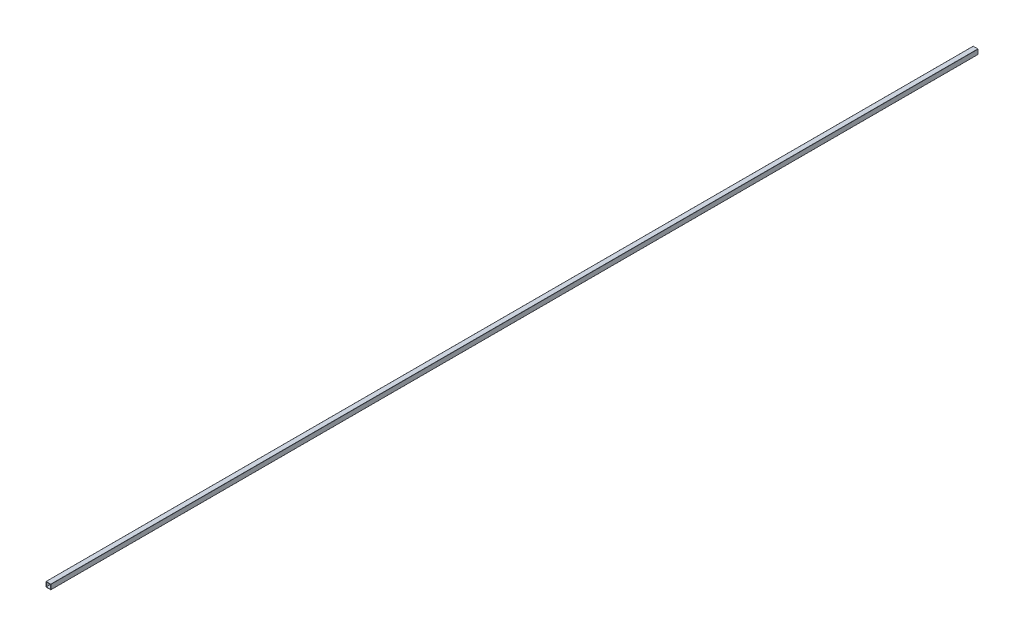
ISO-10303-21;
HEADER;
FILE_DESCRIPTION(('STEP AP214'),'2;1');
FILE_NAME('part.step','',(''),(''),'','','');
FILE_SCHEMA(('AUTOMOTIVE_DESIGN { 1 0 10303 214 1 1 1 1 }'));
ENDSEC;
DATA;
#1=APPLICATION_CONTEXT('core data for automotive mechanical design processes');
#2=APPLICATION_PROTOCOL_DEFINITION('international standard','automotive_design',2000,#1);
#3=PRODUCT_CONTEXT('',#1,'mechanical');
#4=PRODUCT('Part','Part','',(#3));
#5=PRODUCT_RELATED_PRODUCT_CATEGORY('part','',(#4));
#6=PRODUCT_DEFINITION_FORMATION('','',#4);
#7=PRODUCT_DEFINITION_CONTEXT('part definition',#1,'design');
#8=PRODUCT_DEFINITION('design','',#6,#7);
#9=PRODUCT_DEFINITION_SHAPE('','',#8);
#10=(LENGTH_UNIT() NAMED_UNIT(*) SI_UNIT(.MILLI.,.METRE.));
#11=(NAMED_UNIT(*) PLANE_ANGLE_UNIT() SI_UNIT($,.RADIAN.));
#12=(NAMED_UNIT(*) SI_UNIT($,.STERADIAN.) SOLID_ANGLE_UNIT());
#13=UNCERTAINTY_MEASURE_WITH_UNIT(LENGTH_MEASURE(1.E-05),#10,'distance_accuracy_value','');
#14=(GEOMETRIC_REPRESENTATION_CONTEXT(3) GLOBAL_UNCERTAINTY_ASSIGNED_CONTEXT((#13)) GLOBAL_UNIT_ASSIGNED_CONTEXT((#10,
#11,#12)) REPRESENTATION_CONTEXT('',''));
#15=CARTESIAN_POINT('',(0.,0.,0.));
#16=DIRECTION('',(0.,0.,1.));
#17=DIRECTION('',(1.,0.,0.));
#18=AXIS2_PLACEMENT_3D('',#15,#16,#17);
#19=CARTESIAN_POINT('',(14.85,14.85,6000.));
#20=DIRECTION('',(0.,0.,-1.));
#21=DIRECTION('',(-1.,0.,0.));
#22=AXIS2_PLACEMENT_3D('',#19,#20,#21);
#23=PLANE('',#22);
#24=CARTESIAN_POINT('',(14.85,14.85,6000.));
#25=DIRECTION('',(0.,0.,1.));
#26=DIRECTION('',(-1.,0.,0.));
#27=AXIS2_PLACEMENT_3D('',#24,#25,#26);
#28=CIRCLE('',#27,0.999999999999999);
#29=CARTESIAN_POINT('',(15.85,14.85,6000.));
#30=VERTEX_POINT('',#29);
#31=CARTESIAN_POINT('',(14.85,15.85,6000.));
#32=VERTEX_POINT('',#31);
#33=EDGE_CURVE('E158',#30,#32,#28,.T.);
#34=ORIENTED_EDGE('',*,*,#33,.T.);
#35=DIRECTION('',(-1.,0.,0.));
#36=VECTOR('',#35,1.);
#37=CARTESIAN_POINT('',(-14.85,15.85,6000.));
#38=LINE('',#37,#36);
#39=CARTESIAN_POINT('',(-14.85,15.85,6000.));
#40=VERTEX_POINT('',#39);
#41=EDGE_CURVE('E161',#32,#40,#38,.T.);
#42=ORIENTED_EDGE('',*,*,#41,.T.);
#43=CARTESIAN_POINT('',(-14.85,14.85,6000.));
#44=DIRECTION('',(0.,0.,1.));
#45=DIRECTION('',(-1.,0.,0.));
#46=AXIS2_PLACEMENT_3D('',#43,#44,#45);
#47=CIRCLE('',#46,1.);
#48=CARTESIAN_POINT('',(-15.85,14.85,6000.));
#49=VERTEX_POINT('',#48);
#50=EDGE_CURVE('E164',#40,#49,#47,.T.);
#51=ORIENTED_EDGE('',*,*,#50,.T.);
#52=DIRECTION('',(0.,-1.,0.));
#53=VECTOR('',#52,1.);
#54=CARTESIAN_POINT('',(-15.85,-14.85,6000.));
#55=LINE('',#54,#53);
#56=CARTESIAN_POINT('',(-15.85,-14.85,6000.));
#57=VERTEX_POINT('',#56);
#58=EDGE_CURVE('E166',#49,#57,#55,.T.);
#59=ORIENTED_EDGE('',*,*,#58,.T.);
#60=CARTESIAN_POINT('',(-14.85,-14.85,6000.));
#61=DIRECTION('',(0.,0.,1.));
#62=DIRECTION('',(1.,0.,0.));
#63=AXIS2_PLACEMENT_3D('',#60,#61,#62);
#64=CIRCLE('',#63,0.999999999999999);
#65=CARTESIAN_POINT('',(-14.85,-15.85,6000.));
#66=VERTEX_POINT('',#65);
#67=EDGE_CURVE('E168',#57,#66,#64,.T.);
#68=ORIENTED_EDGE('',*,*,#67,.T.);
#69=DIRECTION('',(1.,0.,0.));
#70=VECTOR('',#69,1.);
#71=CARTESIAN_POINT('',(-14.85,-15.85,6000.));
#72=LINE('',#71,#70);
#73=CARTESIAN_POINT('',(14.85,-15.85,6000.));
#74=VERTEX_POINT('',#73);
#75=EDGE_CURVE('E170',#66,#74,#72,.T.);
#76=ORIENTED_EDGE('',*,*,#75,.T.);
#77=CARTESIAN_POINT('',(14.85,-14.85,6000.));
#78=DIRECTION('',(0.,0.,1.));
#79=DIRECTION('',(1.,0.,0.));
#80=AXIS2_PLACEMENT_3D('',#77,#78,#79);
#81=CIRCLE('',#80,1.);
#82=CARTESIAN_POINT('',(15.85,-14.85,6000.));
#83=VERTEX_POINT('',#82);
#84=EDGE_CURVE('E172',#74,#83,#81,.T.);
#85=ORIENTED_EDGE('',*,*,#84,.T.);
#86=DIRECTION('',(0.,1.,0.));
#87=VECTOR('',#86,1.);
#88=CARTESIAN_POINT('',(15.85,-14.85,6000.));
#89=LINE('',#88,#87);
#90=EDGE_CURVE('E174',#83,#30,#89,.T.);
#91=ORIENTED_EDGE('',*,*,#90,.T.);
#92=EDGE_LOOP('',(#34,#42,#51,#59,#68,#76,#85,#91));
#93=FACE_BOUND('',#92,.T.);
#94=DIRECTION('',(1.,0.,0.));
#95=VECTOR('',#94,1.);
#96=CARTESIAN_POINT('',(-13.96,-13.96,6000.));
#97=LINE('',#96,#95);
#98=CARTESIAN_POINT('',(-13.96,-13.96,6000.));
#99=VERTEX_POINT('',#98);
#100=CARTESIAN_POINT('',(13.96,-13.96,6000.));
#101=VERTEX_POINT('',#100);
#102=EDGE_CURVE('E122',#99,#101,#97,.T.);
#103=ORIENTED_EDGE('',*,*,#102,.F.);
#104=DIRECTION('',(0.,-1.,0.));
#105=VECTOR('',#104,1.);
#106=CARTESIAN_POINT('',(-13.96,-13.96,6000.));
#107=LINE('',#106,#105);
#108=CARTESIAN_POINT('',(-13.96,13.96,6000.));
#109=VERTEX_POINT('',#108);
#110=EDGE_CURVE('E144',#109,#99,#107,.T.);
#111=ORIENTED_EDGE('',*,*,#110,.F.);
#112=DIRECTION('',(-1.,0.,0.));
#113=VECTOR('',#112,1.);
#114=CARTESIAN_POINT('',(-13.96,13.96,6000.));
#115=LINE('',#114,#113);
#116=CARTESIAN_POINT('',(13.96,13.96,6000.));
#117=VERTEX_POINT('',#116);
#118=EDGE_CURVE('E142',#117,#109,#115,.T.);
#119=ORIENTED_EDGE('',*,*,#118,.F.);
#120=DIRECTION('',(0.,1.,0.));
#121=VECTOR('',#120,1.);
#122=CARTESIAN_POINT('',(13.96,-13.96,6000.));
#123=LINE('',#122,#121);
#124=EDGE_CURVE('E130',#101,#117,#123,.T.);
#125=ORIENTED_EDGE('',*,*,#124,.F.);
#126=EDGE_LOOP('',(#103,#111,#119,#125));
#127=FACE_BOUND('',#126,.T.);
#128=ADVANCED_FACE('F33',(#93,#127),#23,.F.);
#129=CARTESIAN_POINT('',(14.85,14.85,0.));
#130=DIRECTION('',(0.,0.,-1.));
#131=DIRECTION('',(-1.,0.,0.));
#132=AXIS2_PLACEMENT_3D('',#129,#130,#131);
#133=PLANE('',#132);
#134=CARTESIAN_POINT('',(14.85,14.85,0.));
#135=DIRECTION('',(0.,0.,1.));
#136=DIRECTION('',(-1.,0.,0.));
#137=AXIS2_PLACEMENT_3D('',#134,#135,#136);
#138=CIRCLE('',#137,0.999999999999999);
#139=CARTESIAN_POINT('',(15.85,14.85,0.));
#140=VERTEX_POINT('',#139);
#141=CARTESIAN_POINT('',(14.85,15.85,0.));
#142=VERTEX_POINT('',#141);
#143=EDGE_CURVE('E138',#140,#142,#138,.T.);
#144=ORIENTED_EDGE('',*,*,#143,.F.);
#145=DIRECTION('',(0.,1.,0.));
#146=VECTOR('',#145,1.);
#147=CARTESIAN_POINT('',(15.85,-14.85,0.));
#148=LINE('',#147,#146);
#149=CARTESIAN_POINT('',(15.85,-14.85,0.));
#150=VERTEX_POINT('',#149);
#151=EDGE_CURVE('E162',#150,#140,#148,.T.);
#152=ORIENTED_EDGE('',*,*,#151,.F.);
#153=CARTESIAN_POINT('',(14.85,-14.85,0.));
#154=DIRECTION('',(0.,0.,1.));
#155=DIRECTION('',(1.,0.,0.));
#156=AXIS2_PLACEMENT_3D('',#153,#154,#155);
#157=CIRCLE('',#156,1.);
#158=CARTESIAN_POINT('',(14.85,-15.85,0.));
#159=VERTEX_POINT('',#158);
#160=EDGE_CURVE('E189',#159,#150,#157,.T.);
#161=ORIENTED_EDGE('',*,*,#160,.F.);
#162=DIRECTION('',(1.,0.,0.));
#163=VECTOR('',#162,1.);
#164=CARTESIAN_POINT('',(-14.85,-15.85,0.));
#165=LINE('',#164,#163);
#166=CARTESIAN_POINT('',(-14.85,-15.85,0.));
#167=VERTEX_POINT('',#166);
#168=EDGE_CURVE('E187',#167,#159,#165,.T.);
#169=ORIENTED_EDGE('',*,*,#168,.F.);
#170=CARTESIAN_POINT('',(-14.85,-14.85,0.));
#171=DIRECTION('',(0.,0.,1.));
#172=DIRECTION('',(1.,0.,0.));
#173=AXIS2_PLACEMENT_3D('',#170,#171,#172);
#174=CIRCLE('',#173,0.999999999999999);
#175=CARTESIAN_POINT('',(-15.85,-14.85,0.));
#176=VERTEX_POINT('',#175);
#177=EDGE_CURVE('E185',#176,#167,#174,.T.);
#178=ORIENTED_EDGE('',*,*,#177,.F.);
#179=DIRECTION('',(0.,-1.,0.));
#180=VECTOR('',#179,1.);
#181=CARTESIAN_POINT('',(-15.85,-14.85,0.));
#182=LINE('',#181,#180);
#183=CARTESIAN_POINT('',(-15.85,14.85,0.));
#184=VERTEX_POINT('',#183);
#185=EDGE_CURVE('E183',#184,#176,#182,.T.);
#186=ORIENTED_EDGE('',*,*,#185,.F.);
#187=CARTESIAN_POINT('',(-14.85,14.85,0.));
#188=DIRECTION('',(0.,0.,1.));
#189=DIRECTION('',(-1.,0.,0.));
#190=AXIS2_PLACEMENT_3D('',#187,#188,#189);
#191=CIRCLE('',#190,1.);
#192=CARTESIAN_POINT('',(-14.85,15.85,0.));
#193=VERTEX_POINT('',#192);
#194=EDGE_CURVE('E181',#193,#184,#191,.T.);
#195=ORIENTED_EDGE('',*,*,#194,.F.);
#196=DIRECTION('',(-1.,0.,0.));
#197=VECTOR('',#196,1.);
#198=CARTESIAN_POINT('',(-14.85,15.85,0.));
#199=LINE('',#198,#197);
#200=EDGE_CURVE('E179',#142,#193,#199,.T.);
#201=ORIENTED_EDGE('',*,*,#200,.F.);
#202=EDGE_LOOP('',(#144,#152,#161,#169,#178,#186,#195,#201));
#203=FACE_BOUND('',#202,.T.);
#204=DIRECTION('',(0.,-1.,0.));
#205=VECTOR('',#204,1.);
#206=CARTESIAN_POINT('',(-13.96,-13.96,0.));
#207=LINE('',#206,#205);
#208=CARTESIAN_POINT('',(-13.96,13.96,0.));
#209=VERTEX_POINT('',#208);
#210=CARTESIAN_POINT('',(-13.96,-13.96,0.));
#211=VERTEX_POINT('',#210);
#212=EDGE_CURVE('E131',#209,#211,#207,.T.);
#213=ORIENTED_EDGE('',*,*,#212,.T.);
#214=DIRECTION('',(1.,0.,0.));
#215=VECTOR('',#214,1.);
#216=CARTESIAN_POINT('',(-13.96,-13.96,0.));
#217=LINE('',#216,#215);
#218=CARTESIAN_POINT('',(13.96,-13.96,0.));
#219=VERTEX_POINT('',#218);
#220=EDGE_CURVE('E56',#211,#219,#217,.T.);
#221=ORIENTED_EDGE('',*,*,#220,.T.);
#222=DIRECTION('',(0.,1.,0.));
#223=VECTOR('',#222,1.);
#224=CARTESIAN_POINT('',(13.96,-13.96,0.));
#225=LINE('',#224,#223);
#226=CARTESIAN_POINT('',(13.96,13.96,0.));
#227=VERTEX_POINT('',#226);
#228=EDGE_CURVE('E137',#219,#227,#225,.T.);
#229=ORIENTED_EDGE('',*,*,#228,.T.);
#230=DIRECTION('',(-1.,0.,0.));
#231=VECTOR('',#230,1.);
#232=CARTESIAN_POINT('',(-13.96,13.96,0.));
#233=LINE('',#232,#231);
#234=EDGE_CURVE('E150',#227,#209,#233,.T.);
#235=ORIENTED_EDGE('',*,*,#234,.T.);
#236=EDGE_LOOP('',(#213,#221,#229,#235));
#237=FACE_BOUND('',#236,.T.);
#238=ADVANCED_FACE('F219',(#203,#237),#133,.T.);
#239=CARTESIAN_POINT('',(14.85,14.85,6000.));
#240=DIRECTION('',(0.,0.,-1.));
#241=DIRECTION('',(-1.,0.,0.));
#242=AXIS2_PLACEMENT_3D('',#239,#240,#241);
#243=CYLINDRICAL_SURFACE('',#242,0.999999999999999);
#244=ORIENTED_EDGE('',*,*,#143,.T.);
#245=DIRECTION('',(0.,0.,-1.));
#246=VECTOR('',#245,1.);
#247=CARTESIAN_POINT('',(14.85,15.85,6000.));
#248=LINE('',#247,#246);
#249=EDGE_CURVE('E11',#32,#142,#248,.T.);
#250=ORIENTED_EDGE('',*,*,#249,.F.);
#251=ORIENTED_EDGE('',*,*,#33,.F.);
#252=DIRECTION('',(0.,0.,-1.));
#253=VECTOR('',#252,1.);
#254=CARTESIAN_POINT('',(15.85,14.85,6000.));
#255=LINE('',#254,#253);
#256=EDGE_CURVE('E176',#30,#140,#255,.T.);
#257=ORIENTED_EDGE('',*,*,#256,.T.);
#258=EDGE_LOOP('',(#244,#250,#251,#257));
#259=FACE_BOUND('',#258,.T.);
#260=ADVANCED_FACE('F35',(#259),#243,.T.);
#261=CARTESIAN_POINT('',(-14.85,15.85,6000.));
#262=DIRECTION('',(0.,-1.,0.));
#263=DIRECTION('',(0.,0.,-1.));
#264=AXIS2_PLACEMENT_3D('',#261,#262,#263);
#265=PLANE('',#264);
#266=ORIENTED_EDGE('',*,*,#200,.T.);
#267=DIRECTION('',(0.,0.,-1.));
#268=VECTOR('',#267,1.);
#269=CARTESIAN_POINT('',(-14.85,15.85,6000.));
#270=LINE('',#269,#268);
#271=EDGE_CURVE('E41',#40,#193,#270,.T.);
#272=ORIENTED_EDGE('',*,*,#271,.F.);
#273=ORIENTED_EDGE('',*,*,#41,.F.);
#274=ORIENTED_EDGE('',*,*,#249,.T.);
#275=EDGE_LOOP('',(#266,#272,#273,#274));
#276=FACE_BOUND('',#275,.T.);
#277=ADVANCED_FACE('F236',(#276),#265,.F.);
#278=CARTESIAN_POINT('',(-14.85,14.85,6000.));
#279=DIRECTION('',(0.,0.,-1.));
#280=DIRECTION('',(-1.,0.,0.));
#281=AXIS2_PLACEMENT_3D('',#278,#279,#280);
#282=CYLINDRICAL_SURFACE('',#281,1.);
#283=ORIENTED_EDGE('',*,*,#194,.T.);
#284=DIRECTION('',(0.,0.,-1.));
#285=VECTOR('',#284,1.);
#286=CARTESIAN_POINT('',(-15.85,14.85,6000.));
#287=LINE('',#286,#285);
#288=EDGE_CURVE('E206',#49,#184,#287,.T.);
#289=ORIENTED_EDGE('',*,*,#288,.F.);
#290=ORIENTED_EDGE('',*,*,#50,.F.);
#291=ORIENTED_EDGE('',*,*,#271,.T.);
#292=EDGE_LOOP('',(#283,#289,#290,#291));
#293=FACE_BOUND('',#292,.T.);
#294=ADVANCED_FACE('F213',(#293),#282,.T.);
#295=CARTESIAN_POINT('',(-15.85,-14.85,6000.));
#296=DIRECTION('',(1.,0.,0.));
#297=DIRECTION('',(0.,0.,-1.));
#298=AXIS2_PLACEMENT_3D('',#295,#296,#297);
#299=PLANE('',#298);
#300=ORIENTED_EDGE('',*,*,#185,.T.);
#301=DIRECTION('',(0.,0.,-1.));
#302=VECTOR('',#301,1.);
#303=CARTESIAN_POINT('',(-15.85,-14.85,6000.));
#304=LINE('',#303,#302);
#305=EDGE_CURVE('E203',#57,#176,#304,.T.);
#306=ORIENTED_EDGE('',*,*,#305,.F.);
#307=ORIENTED_EDGE('',*,*,#58,.F.);
#308=ORIENTED_EDGE('',*,*,#288,.T.);
#309=EDGE_LOOP('',(#300,#306,#307,#308));
#310=FACE_BOUND('',#309,.T.);
#311=ADVANCED_FACE('F225',(#310),#299,.F.);
#312=CARTESIAN_POINT('',(-14.85,-14.85,6000.));
#313=DIRECTION('',(0.,0.,-1.));
#314=DIRECTION('',(-1.,0.,0.));
#315=AXIS2_PLACEMENT_3D('',#312,#313,#314);
#316=CYLINDRICAL_SURFACE('',#315,0.999999999999999);
#317=ORIENTED_EDGE('',*,*,#177,.T.);
#318=DIRECTION('',(0.,0.,-1.));
#319=VECTOR('',#318,1.);
#320=CARTESIAN_POINT('',(-14.85,-15.85,6000.));
#321=LINE('',#320,#319);
#322=EDGE_CURVE('E200',#66,#167,#321,.T.);
#323=ORIENTED_EDGE('',*,*,#322,.F.);
#324=ORIENTED_EDGE('',*,*,#67,.F.);
#325=ORIENTED_EDGE('',*,*,#305,.T.);
#326=EDGE_LOOP('',(#317,#323,#324,#325));
#327=FACE_BOUND('',#326,.T.);
#328=ADVANCED_FACE('F229',(#327),#316,.T.);
#329=CARTESIAN_POINT('',(-14.85,-15.85,6000.));
#330=DIRECTION('',(0.,1.,0.));
#331=DIRECTION('',(0.,0.,1.));
#332=AXIS2_PLACEMENT_3D('',#329,#330,#331);
#333=PLANE('',#332);
#334=ORIENTED_EDGE('',*,*,#168,.T.);
#335=DIRECTION('',(0.,0.,-1.));
#336=VECTOR('',#335,1.);
#337=CARTESIAN_POINT('',(14.85,-15.85,6000.));
#338=LINE('',#337,#336);
#339=EDGE_CURVE('E197',#74,#159,#338,.T.);
#340=ORIENTED_EDGE('',*,*,#339,.F.);
#341=ORIENTED_EDGE('',*,*,#75,.F.);
#342=ORIENTED_EDGE('',*,*,#322,.T.);
#343=EDGE_LOOP('',(#334,#340,#341,#342));
#344=FACE_BOUND('',#343,.T.);
#345=ADVANCED_FACE('F249',(#344),#333,.F.);
#346=CARTESIAN_POINT('',(14.85,-14.85,6000.));
#347=DIRECTION('',(0.,0.,-1.));
#348=DIRECTION('',(-1.,0.,0.));
#349=AXIS2_PLACEMENT_3D('',#346,#347,#348);
#350=CYLINDRICAL_SURFACE('',#349,1.);
#351=ORIENTED_EDGE('',*,*,#160,.T.);
#352=DIRECTION('',(0.,0.,-1.));
#353=VECTOR('',#352,1.);
#354=CARTESIAN_POINT('',(15.85,-14.85,6000.));
#355=LINE('',#354,#353);
#356=EDGE_CURVE('E194',#83,#150,#355,.T.);
#357=ORIENTED_EDGE('',*,*,#356,.F.);
#358=ORIENTED_EDGE('',*,*,#84,.F.);
#359=ORIENTED_EDGE('',*,*,#339,.T.);
#360=EDGE_LOOP('',(#351,#357,#358,#359));
#361=FACE_BOUND('',#360,.T.);
#362=ADVANCED_FACE('F247',(#361),#350,.T.);
#363=CARTESIAN_POINT('',(15.85,-14.85,6000.));
#364=DIRECTION('',(-1.,0.,0.));
#365=DIRECTION('',(0.,0.,1.));
#366=AXIS2_PLACEMENT_3D('',#363,#364,#365);
#367=PLANE('',#366);
#368=ORIENTED_EDGE('',*,*,#151,.T.);
#369=ORIENTED_EDGE('',*,*,#256,.F.);
#370=ORIENTED_EDGE('',*,*,#90,.F.);
#371=ORIENTED_EDGE('',*,*,#356,.T.);
#372=EDGE_LOOP('',(#368,#369,#370,#371));
#373=FACE_BOUND('',#372,.T.);
#374=ADVANCED_FACE('F242',(#373),#367,.F.);
#375=CARTESIAN_POINT('',(-13.96,-13.96,6000.));
#376=DIRECTION('',(0.,1.,0.));
#377=DIRECTION('',(0.,0.,1.));
#378=AXIS2_PLACEMENT_3D('',#375,#376,#377);
#379=PLANE('',#378);
#380=ORIENTED_EDGE('',*,*,#220,.F.);
#381=DIRECTION('',(0.,0.,-1.));
#382=VECTOR('',#381,1.);
#383=CARTESIAN_POINT('',(-13.96,-13.96,6000.));
#384=LINE('',#383,#382);
#385=EDGE_CURVE('E126',#99,#211,#384,.T.);
#386=ORIENTED_EDGE('',*,*,#385,.F.);
#387=ORIENTED_EDGE('',*,*,#102,.T.);
#388=DIRECTION('',(0.,0.,-1.));
#389=VECTOR('',#388,1.);
#390=CARTESIAN_POINT('',(13.96,-13.96,6000.));
#391=LINE('',#390,#389);
#392=EDGE_CURVE('E125',#101,#219,#391,.T.);
#393=ORIENTED_EDGE('',*,*,#392,.T.);
#394=EDGE_LOOP('',(#380,#386,#387,#393));
#395=FACE_BOUND('',#394,.T.);
#396=ADVANCED_FACE('F124',(#395),#379,.T.);
#397=CARTESIAN_POINT('',(13.96,-13.96,6000.));
#398=DIRECTION('',(-1.,0.,0.));
#399=DIRECTION('',(0.,0.,1.));
#400=AXIS2_PLACEMENT_3D('',#397,#398,#399);
#401=PLANE('',#400);
#402=ORIENTED_EDGE('',*,*,#228,.F.);
#403=ORIENTED_EDGE('',*,*,#392,.F.);
#404=ORIENTED_EDGE('',*,*,#124,.T.);
#405=DIRECTION('',(0.,0.,-1.));
#406=VECTOR('',#405,1.);
#407=CARTESIAN_POINT('',(13.96,13.96,6000.));
#408=LINE('',#407,#406);
#409=EDGE_CURVE('E139',#117,#227,#408,.T.);
#410=ORIENTED_EDGE('',*,*,#409,.T.);
#411=EDGE_LOOP('',(#402,#403,#404,#410));
#412=FACE_BOUND('',#411,.T.);
#413=ADVANCED_FACE('F134',(#412),#401,.T.);
#414=CARTESIAN_POINT('',(-13.96,13.96,6000.));
#415=DIRECTION('',(0.,-1.,0.));
#416=DIRECTION('',(0.,0.,-1.));
#417=AXIS2_PLACEMENT_3D('',#414,#415,#416);
#418=PLANE('',#417);
#419=ORIENTED_EDGE('',*,*,#234,.F.);
#420=ORIENTED_EDGE('',*,*,#409,.F.);
#421=ORIENTED_EDGE('',*,*,#118,.T.);
#422=DIRECTION('',(0.,0.,-1.));
#423=VECTOR('',#422,1.);
#424=CARTESIAN_POINT('',(-13.96,13.96,6000.));
#425=LINE('',#424,#423);
#426=EDGE_CURVE('E48',#109,#209,#425,.T.);
#427=ORIENTED_EDGE('',*,*,#426,.T.);
#428=EDGE_LOOP('',(#419,#420,#421,#427));
#429=FACE_BOUND('',#428,.T.);
#430=ADVANCED_FACE('F274',(#429),#418,.T.);
#431=CARTESIAN_POINT('',(-13.96,-13.96,6000.));
#432=DIRECTION('',(1.,0.,0.));
#433=DIRECTION('',(0.,0.,-1.));
#434=AXIS2_PLACEMENT_3D('',#431,#432,#433);
#435=PLANE('',#434);
#436=ORIENTED_EDGE('',*,*,#212,.F.);
#437=ORIENTED_EDGE('',*,*,#426,.F.);
#438=ORIENTED_EDGE('',*,*,#110,.T.);
#439=ORIENTED_EDGE('',*,*,#385,.T.);
#440=EDGE_LOOP('',(#436,#437,#438,#439));
#441=FACE_BOUND('',#440,.T.);
#442=ADVANCED_FACE('F278',(#441),#435,.T.);
#443=CLOSED_SHELL('',(#128,#238,#260,#277,#294,#311,#328,#345,#362,#374,#396,#413,#430,#442));
#444=MANIFOLD_SOLID_BREP('B2',#443);
#445=ADVANCED_BREP_SHAPE_REPRESENTATION('',(#18,#444),#14);
#446=SHAPE_DEFINITION_REPRESENTATION(#9,#445);
ENDSEC;
END-ISO-10303-21;
